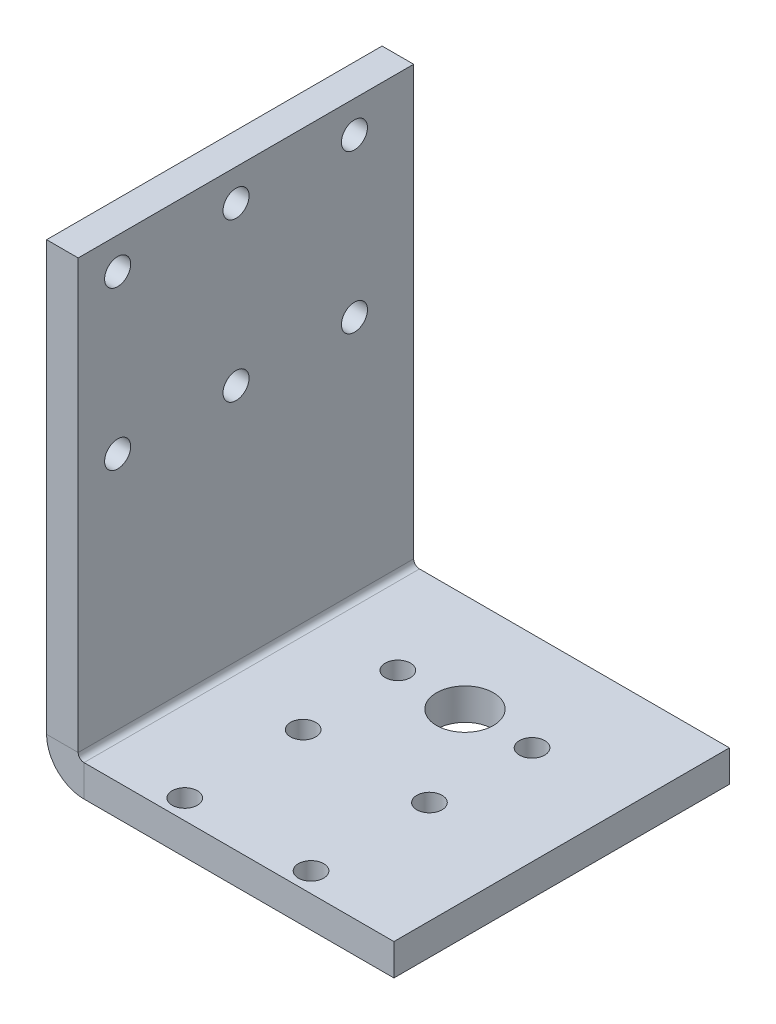
ISO-10303-21;
HEADER;
FILE_DESCRIPTION(('STEP AP214'),'2;1');
FILE_NAME('part.step','',(''),(''),'','','');
FILE_SCHEMA(('AUTOMOTIVE_DESIGN { 1 0 10303 214 1 1 1 1 }'));
ENDSEC;
DATA;
#1=APPLICATION_CONTEXT('core data for automotive mechanical design processes');
#2=APPLICATION_PROTOCOL_DEFINITION('international standard','automotive_design',2000,#1);
#3=PRODUCT_CONTEXT('',#1,'mechanical');
#4=PRODUCT('Part','Part','',(#3));
#5=PRODUCT_RELATED_PRODUCT_CATEGORY('part','',(#4));
#6=PRODUCT_DEFINITION_FORMATION('','',#4);
#7=PRODUCT_DEFINITION_CONTEXT('part definition',#1,'design');
#8=PRODUCT_DEFINITION('design','',#6,#7);
#9=PRODUCT_DEFINITION_SHAPE('','',#8);
#10=(LENGTH_UNIT() NAMED_UNIT(*) SI_UNIT(.MILLI.,.METRE.));
#11=(NAMED_UNIT(*) PLANE_ANGLE_UNIT() SI_UNIT($,.RADIAN.));
#12=(NAMED_UNIT(*) SI_UNIT($,.STERADIAN.) SOLID_ANGLE_UNIT());
#13=UNCERTAINTY_MEASURE_WITH_UNIT(LENGTH_MEASURE(1.E-05),#10,'distance_accuracy_value','');
#14=(GEOMETRIC_REPRESENTATION_CONTEXT(3) GLOBAL_UNCERTAINTY_ASSIGNED_CONTEXT((#13)) GLOBAL_UNIT_ASSIGNED_CONTEXT((#10,
#11,#12)) REPRESENTATION_CONTEXT('',''));
#15=CARTESIAN_POINT('',(0.,0.,0.));
#16=DIRECTION('',(0.,0.,1.));
#17=DIRECTION('',(1.,0.,0.));
#18=AXIS2_PLACEMENT_3D('',#15,#16,#17);
#19=CARTESIAN_POINT('',(0.,31.,-13.75));
#20=DIRECTION('',(1.,0.,0.));
#21=DIRECTION('',(0.,0.,-1.));
#22=AXIS2_PLACEMENT_3D('',#19,#20,#21);
#23=CYLINDRICAL_SURFACE('',#22,1.65);
#24=CARTESIAN_POINT('',(-4.,31.,-13.75));
#25=DIRECTION('',(1.,0.,0.));
#26=DIRECTION('',(0.,0.,-1.));
#27=AXIS2_PLACEMENT_3D('',#24,#25,#26);
#28=CIRCLE('',#27,1.65);
#29=CARTESIAN_POINT('',(-4.,31.,-15.4));
#30=VERTEX_POINT('',#29);
#31=EDGE_CURVE('E47',#30,#30,#28,.T.);
#32=ORIENTED_EDGE('',*,*,#31,.F.);
#33=EDGE_LOOP('',(#32));
#34=FACE_BOUND('',#33,.T.);
#35=CARTESIAN_POINT('',(0.,31.,-13.75));
#36=DIRECTION('',(1.,0.,0.));
#37=DIRECTION('',(0.,0.,-1.));
#38=AXIS2_PLACEMENT_3D('',#35,#36,#37);
#39=CIRCLE('',#38,1.65);
#40=CARTESIAN_POINT('',(0.,31.,-15.4));
#41=VERTEX_POINT('',#40);
#42=EDGE_CURVE('E11',#41,#41,#39,.T.);
#43=ORIENTED_EDGE('',*,*,#42,.T.);
#44=EDGE_LOOP('',(#43));
#45=FACE_BOUND('',#44,.T.);
#46=ADVANCED_FACE('F39',(#34,#45),#23,.F.);
#47=CARTESIAN_POINT('',(0.,51.,-13.75));
#48=DIRECTION('',(1.,0.,0.));
#49=DIRECTION('',(0.,0.,-1.));
#50=AXIS2_PLACEMENT_3D('',#47,#48,#49);
#51=CYLINDRICAL_SURFACE('',#50,1.65);
#52=CARTESIAN_POINT('',(-4.,51.,-13.75));
#53=DIRECTION('',(1.,0.,0.));
#54=DIRECTION('',(0.,0.,-1.));
#55=AXIS2_PLACEMENT_3D('',#52,#53,#54);
#56=CIRCLE('',#55,1.65);
#57=CARTESIAN_POINT('',(-4.,51.,-15.4));
#58=VERTEX_POINT('',#57);
#59=EDGE_CURVE('E183',#58,#58,#56,.T.);
#60=ORIENTED_EDGE('',*,*,#59,.F.);
#61=EDGE_LOOP('',(#60));
#62=FACE_BOUND('',#61,.T.);
#63=CARTESIAN_POINT('',(0.,51.,-13.75));
#64=DIRECTION('',(1.,0.,0.));
#65=DIRECTION('',(0.,0.,-1.));
#66=AXIS2_PLACEMENT_3D('',#63,#64,#65);
#67=CIRCLE('',#66,1.65);
#68=CARTESIAN_POINT('',(0.,51.,-15.4));
#69=VERTEX_POINT('',#68);
#70=EDGE_CURVE('E196',#69,#69,#67,.T.);
#71=ORIENTED_EDGE('',*,*,#70,.T.);
#72=EDGE_LOOP('',(#71));
#73=FACE_BOUND('',#72,.T.);
#74=ADVANCED_FACE('F204',(#62,#73),#51,.F.);
#75=CARTESIAN_POINT('',(0.7366,0.,21.25));
#76=DIRECTION('',(0.,0.,1.));
#77=DIRECTION('',(1.,0.,0.));
#78=AXIS2_PLACEMENT_3D('',#75,#76,#77);
#79=PLANE('',#78);
#80=DIRECTION('',(0.,-1.,0.));
#81=VECTOR('',#80,1.);
#82=CARTESIAN_POINT('',(0.7366,0.,21.25));
#83=LINE('',#82,#81);
#84=CARTESIAN_POINT('',(0.7366,0.,21.25));
#85=VERTEX_POINT('',#84);
#86=CARTESIAN_POINT('',(0.7366,-4.,21.25));
#87=VERTEX_POINT('',#86);
#88=EDGE_CURVE('E55',#85,#87,#83,.T.);
#89=ORIENTED_EDGE('',*,*,#88,.F.);
#90=CARTESIAN_POINT('',(0.7366,0.7366,21.25));
#91=DIRECTION('',(0.,0.,-1.));
#92=DIRECTION('',(-1.,0.,0.));
#93=AXIS2_PLACEMENT_3D('',#90,#91,#92);
#94=CIRCLE('',#93,0.7366);
#95=CARTESIAN_POINT('',(0.,0.7366,21.25));
#96=VERTEX_POINT('',#95);
#97=EDGE_CURVE('E139',#96,#85,#94,.F.);
#98=ORIENTED_EDGE('',*,*,#97,.F.);
#99=DIRECTION('',(1.,0.,0.));
#100=VECTOR('',#99,1.);
#101=CARTESIAN_POINT('',(-4.,0.736600000000001,21.25));
#102=LINE('',#101,#100);
#103=CARTESIAN_POINT('',(-4.,0.736600000000001,21.25));
#104=VERTEX_POINT('',#103);
#105=EDGE_CURVE('E180',#104,#96,#102,.T.);
#106=ORIENTED_EDGE('',*,*,#105,.F.);
#107=CARTESIAN_POINT('',(0.7366,0.7366,21.25));
#108=DIRECTION('',(0.,0.,1.));
#109=DIRECTION('',(1.,0.,0.));
#110=AXIS2_PLACEMENT_3D('',#107,#108,#109);
#111=CIRCLE('',#110,4.7366);
#112=EDGE_CURVE('E132',#104,#87,#111,.T.);
#113=ORIENTED_EDGE('',*,*,#112,.T.);
#114=EDGE_LOOP('',(#89,#98,#106,#113));
#115=FACE_BOUND('',#114,.T.);
#116=ADVANCED_FACE('F244',(#115),#79,.T.);
#117=CARTESIAN_POINT('',(-4.,0.736600000000001,21.25));
#118=DIRECTION('',(0.,0.,1.));
#119=DIRECTION('',(1.,0.,0.));
#120=AXIS2_PLACEMENT_3D('',#117,#118,#119);
#121=PLANE('',#120);
#122=DIRECTION('',(1.,0.,0.));
#123=VECTOR('',#122,1.);
#124=CARTESIAN_POINT('',(0.,0.,21.25));
#125=LINE('',#124,#123);
#126=CARTESIAN_POINT('',(40.,0.,21.25));
#127=VERTEX_POINT('',#126);
#128=EDGE_CURVE('E378',#85,#127,#125,.T.);
#129=ORIENTED_EDGE('',*,*,#128,.F.);
#130=ORIENTED_EDGE('',*,*,#88,.T.);
#131=DIRECTION('',(1.,0.,0.));
#132=VECTOR('',#131,1.);
#133=CARTESIAN_POINT('',(0.,-4.,21.25));
#134=LINE('',#133,#132);
#135=CARTESIAN_POINT('',(40.,-4.,21.25));
#136=VERTEX_POINT('',#135);
#137=EDGE_CURVE('E97',#87,#136,#134,.T.);
#138=ORIENTED_EDGE('',*,*,#137,.T.);
#139=DIRECTION('',(0.,-1.,0.));
#140=VECTOR('',#139,1.);
#141=CARTESIAN_POINT('',(40.,0.,21.25));
#142=LINE('',#141,#140);
#143=EDGE_CURVE('E375',#127,#136,#142,.T.);
#144=ORIENTED_EDGE('',*,*,#143,.F.);
#145=EDGE_LOOP('',(#129,#130,#138,#144));
#146=FACE_BOUND('',#145,.T.);
#147=ADVANCED_FACE('F241',(#146),#121,.T.);
#148=CARTESIAN_POINT('',(0.,0.7366,-21.25));
#149=DIRECTION('',(0.,0.,-1.));
#150=DIRECTION('',(-1.,0.,0.));
#151=AXIS2_PLACEMENT_3D('',#148,#149,#150);
#152=PLANE('',#151);
#153=DIRECTION('',(-1.,0.,0.));
#154=VECTOR('',#153,1.);
#155=CARTESIAN_POINT('',(0.,0.7366,-21.25));
#156=LINE('',#155,#154);
#157=CARTESIAN_POINT('',(0.,0.7366,-21.25));
#158=VERTEX_POINT('',#157);
#159=CARTESIAN_POINT('',(-4.,0.736600000000001,-21.25));
#160=VERTEX_POINT('',#159);
#161=EDGE_CURVE('E84',#158,#160,#156,.T.);
#162=ORIENTED_EDGE('',*,*,#161,.F.);
#163=CARTESIAN_POINT('',(0.7366,0.7366,-21.25));
#164=DIRECTION('',(0.,0.,-1.));
#165=DIRECTION('',(-1.,0.,0.));
#166=AXIS2_PLACEMENT_3D('',#163,#164,#165);
#167=CIRCLE('',#166,0.7366);
#168=CARTESIAN_POINT('',(0.7366,0.,-21.25));
#169=VERTEX_POINT('',#168);
#170=EDGE_CURVE('E155',#158,#169,#167,.F.);
#171=ORIENTED_EDGE('',*,*,#170,.T.);
#172=DIRECTION('',(0.,1.,0.));
#173=VECTOR('',#172,1.);
#174=CARTESIAN_POINT('',(0.7366,-4.,-21.25));
#175=LINE('',#174,#173);
#176=CARTESIAN_POINT('',(0.7366,-4.,-21.25));
#177=VERTEX_POINT('',#176);
#178=EDGE_CURVE('E91',#177,#169,#175,.T.);
#179=ORIENTED_EDGE('',*,*,#178,.F.);
#180=CARTESIAN_POINT('',(0.7366,0.7366,-21.25));
#181=DIRECTION('',(0.,0.,1.));
#182=DIRECTION('',(1.,0.,0.));
#183=AXIS2_PLACEMENT_3D('',#180,#181,#182);
#184=CIRCLE('',#183,4.7366);
#185=EDGE_CURVE('E162',#160,#177,#184,.T.);
#186=ORIENTED_EDGE('',*,*,#185,.F.);
#187=EDGE_LOOP('',(#162,#171,#179,#186));
#188=FACE_BOUND('',#187,.T.);
#189=ADVANCED_FACE('F238',(#188),#152,.T.);
#190=CARTESIAN_POINT('',(0.7366,-4.,-21.25));
#191=DIRECTION('',(0.,0.,-1.));
#192=DIRECTION('',(-1.,0.,0.));
#193=AXIS2_PLACEMENT_3D('',#190,#191,#192);
#194=PLANE('',#193);
#195=DIRECTION('',(0.,-1.,0.));
#196=VECTOR('',#195,1.);
#197=CARTESIAN_POINT('',(0.,0.,-21.25));
#198=LINE('',#197,#196);
#199=CARTESIAN_POINT('',(0.,55.,-21.25));
#200=VERTEX_POINT('',#199);
#201=EDGE_CURVE('E157',#200,#158,#198,.T.);
#202=ORIENTED_EDGE('',*,*,#201,.T.);
#203=ORIENTED_EDGE('',*,*,#161,.T.);
#204=DIRECTION('',(0.,1.,0.));
#205=VECTOR('',#204,1.);
#206=CARTESIAN_POINT('',(-4.,0.,-21.25));
#207=LINE('',#206,#205);
#208=CARTESIAN_POINT('',(-4.,55.,-21.25));
#209=VERTEX_POINT('',#208);
#210=EDGE_CURVE('E160',#209,#160,#207,.F.);
#211=ORIENTED_EDGE('',*,*,#210,.F.);
#212=DIRECTION('',(1.,0.,0.));
#213=VECTOR('',#212,1.);
#214=CARTESIAN_POINT('',(-4.,55.,-21.25));
#215=LINE('',#214,#213);
#216=EDGE_CURVE('E119',#209,#200,#215,.T.);
#217=ORIENTED_EDGE('',*,*,#216,.T.);
#218=EDGE_LOOP('',(#202,#203,#211,#217));
#219=FACE_BOUND('',#218,.T.);
#220=ADVANCED_FACE('F234',(#219),#194,.T.);
#221=CARTESIAN_POINT('',(0.,-4.,21.25));
#222=DIRECTION('',(0.,1.,0.));
#223=DIRECTION('',(0.,0.,1.));
#224=AXIS2_PLACEMENT_3D('',#221,#222,#223);
#225=PLANE('',#224);
#226=CARTESIAN_POINT('',(10.5,-4.,-8.75000000000001));
#227=DIRECTION('',(0.,-1.,0.));
#228=DIRECTION('',(0.,0.,-1.));
#229=AXIS2_PLACEMENT_3D('',#226,#227,#228);
#230=CIRCLE('',#229,1.59999999999999);
#231=CARTESIAN_POINT('',(10.5,-4.,-10.35));
#232=VERTEX_POINT('',#231);
#233=EDGE_CURVE('E193',#232,#232,#230,.T.);
#234=ORIENTED_EDGE('',*,*,#233,.F.);
#235=EDGE_LOOP('',(#234));
#236=FACE_BOUND('',#235,.T.);
#237=CARTESIAN_POINT('',(27.5,-4.,-8.75000000000001));
#238=DIRECTION('',(0.,-1.,0.));
#239=DIRECTION('',(0.,0.,-1.));
#240=AXIS2_PLACEMENT_3D('',#237,#238,#239);
#241=CIRCLE('',#240,1.59999999999999);
#242=CARTESIAN_POINT('',(27.5,-4.,-10.35));
#243=VERTEX_POINT('',#242);
#244=EDGE_CURVE('E192',#243,#243,#241,.T.);
#245=ORIENTED_EDGE('',*,*,#244,.F.);
#246=EDGE_LOOP('',(#245));
#247=FACE_BOUND('',#246,.T.);
#248=CARTESIAN_POINT('',(19.,-4.,-8.75000000000001));
#249=DIRECTION('',(0.,-1.,0.));
#250=DIRECTION('',(0.,0.,-1.));
#251=AXIS2_PLACEMENT_3D('',#248,#249,#250);
#252=CIRCLE('',#251,3.6);
#253=CARTESIAN_POINT('',(19.,-4.,-12.35));
#254=VERTEX_POINT('',#253);
#255=EDGE_CURVE('E188',#254,#254,#252,.T.);
#256=ORIENTED_EDGE('',*,*,#255,.F.);
#257=EDGE_LOOP('',(#256));
#258=FACE_BOUND('',#257,.T.);
#259=CARTESIAN_POINT('',(27.,-4.,18.75));
#260=DIRECTION('',(0.,1.,0.));
#261=DIRECTION('',(0.,0.,1.));
#262=AXIS2_PLACEMENT_3D('',#259,#260,#261);
#263=CIRCLE('',#262,1.59999999999999);
#264=CARTESIAN_POINT('',(27.,-4.,20.35));
#265=VERTEX_POINT('',#264);
#266=EDGE_CURVE('E354',#265,#265,#263,.T.);
#267=ORIENTED_EDGE('',*,*,#266,.T.);
#268=EDGE_LOOP('',(#267));
#269=FACE_BOUND('',#268,.T.);
#270=CARTESIAN_POINT('',(11.,-4.,3.74999999999999));
#271=DIRECTION('',(0.,1.,0.));
#272=DIRECTION('',(0.,0.,1.));
#273=AXIS2_PLACEMENT_3D('',#270,#271,#272);
#274=CIRCLE('',#273,1.59999999999999);
#275=CARTESIAN_POINT('',(11.,-4.,5.34999999999998));
#276=VERTEX_POINT('',#275);
#277=EDGE_CURVE('E360',#276,#276,#274,.T.);
#278=ORIENTED_EDGE('',*,*,#277,.T.);
#279=EDGE_LOOP('',(#278));
#280=FACE_BOUND('',#279,.T.);
#281=CARTESIAN_POINT('',(11.,-4.,18.75));
#282=DIRECTION('',(0.,1.,0.));
#283=DIRECTION('',(0.,0.,1.));
#284=AXIS2_PLACEMENT_3D('',#281,#282,#283);
#285=CIRCLE('',#284,1.59999999999999);
#286=CARTESIAN_POINT('',(11.,-4.,20.35));
#287=VERTEX_POINT('',#286);
#288=EDGE_CURVE('E366',#287,#287,#285,.T.);
#289=ORIENTED_EDGE('',*,*,#288,.T.);
#290=EDGE_LOOP('',(#289));
#291=FACE_BOUND('',#290,.T.);
#292=CARTESIAN_POINT('',(27.,-4.,3.74999999999999));
#293=DIRECTION('',(0.,1.,0.));
#294=DIRECTION('',(0.,0.,1.));
#295=AXIS2_PLACEMENT_3D('',#292,#293,#294);
#296=CIRCLE('',#295,1.59999999999999);
#297=CARTESIAN_POINT('',(27.,-4.,5.34999999999998));
#298=VERTEX_POINT('',#297);
#299=EDGE_CURVE('E149',#298,#298,#296,.T.);
#300=ORIENTED_EDGE('',*,*,#299,.T.);
#301=EDGE_LOOP('',(#300));
#302=FACE_BOUND('',#301,.T.);
#303=DIRECTION('',(1.,0.,0.));
#304=VECTOR('',#303,1.);
#305=CARTESIAN_POINT('',(0.,-4.,-21.25));
#306=LINE('',#305,#304);
#307=CARTESIAN_POINT('',(40.,-4.,-21.25));
#308=VERTEX_POINT('',#307);
#309=EDGE_CURVE('E145',#177,#308,#306,.T.);
#310=ORIENTED_EDGE('',*,*,#309,.T.);
#311=DIRECTION('',(0.,0.,-1.));
#312=VECTOR('',#311,1.);
#313=CARTESIAN_POINT('',(40.,-4.,21.25));
#314=LINE('',#313,#312);
#315=EDGE_CURVE('E176',#136,#308,#314,.T.);
#316=ORIENTED_EDGE('',*,*,#315,.F.);
#317=ORIENTED_EDGE('',*,*,#137,.F.);
#318=DIRECTION('',(0.,0.,-1.));
#319=VECTOR('',#318,1.);
#320=CARTESIAN_POINT('',(0.7366,-4.,21.25));
#321=LINE('',#320,#319);
#322=EDGE_CURVE('E144',#87,#177,#321,.T.);
#323=ORIENTED_EDGE('',*,*,#322,.T.);
#324=EDGE_LOOP('',(#310,#316,#317,#323));
#325=FACE_BOUND('',#324,.T.);
#326=ADVANCED_FACE('F230',(#236,#247,#258,#269,#280,#291,#302,#325),#225,.F.);
#327=CARTESIAN_POINT('',(40.,0.,21.25));
#328=DIRECTION('',(1.,0.,0.));
#329=DIRECTION('',(0.,0.,-1.));
#330=AXIS2_PLACEMENT_3D('',#327,#328,#329);
#331=PLANE('',#330);
#332=DIRECTION('',(0.,-1.,0.));
#333=VECTOR('',#332,1.);
#334=CARTESIAN_POINT('',(40.,0.,-21.25));
#335=LINE('',#334,#333);
#336=CARTESIAN_POINT('',(40.,0.,-21.25));
#337=VERTEX_POINT('',#336);
#338=EDGE_CURVE('E148',#337,#308,#335,.T.);
#339=ORIENTED_EDGE('',*,*,#338,.F.);
#340=DIRECTION('',(0.,0.,-1.));
#341=VECTOR('',#340,1.);
#342=CARTESIAN_POINT('',(40.,0.,21.25));
#343=LINE('',#342,#341);
#344=EDGE_CURVE('E174',#127,#337,#343,.T.);
#345=ORIENTED_EDGE('',*,*,#344,.F.);
#346=ORIENTED_EDGE('',*,*,#143,.T.);
#347=ORIENTED_EDGE('',*,*,#315,.T.);
#348=EDGE_LOOP('',(#339,#345,#346,#347));
#349=FACE_BOUND('',#348,.T.);
#350=ADVANCED_FACE('F226',(#349),#331,.T.);
#351=CARTESIAN_POINT('',(0.,0.,21.25));
#352=DIRECTION('',(0.,1.,0.));
#353=DIRECTION('',(0.,0.,1.));
#354=AXIS2_PLACEMENT_3D('',#351,#352,#353);
#355=PLANE('',#354);
#356=CARTESIAN_POINT('',(10.5,0.,-8.75000000000001));
#357=DIRECTION('',(0.,1.,0.));
#358=DIRECTION('',(0.,0.,1.));
#359=AXIS2_PLACEMENT_3D('',#356,#357,#358);
#360=CIRCLE('',#359,1.59999999999999);
#361=CARTESIAN_POINT('',(10.5,0.,-7.15000000000002));
#362=VERTEX_POINT('',#361);
#363=EDGE_CURVE('E189',#362,#362,#360,.T.);
#364=ORIENTED_EDGE('',*,*,#363,.F.);
#365=EDGE_LOOP('',(#364));
#366=FACE_BOUND('',#365,.T.);
#367=CARTESIAN_POINT('',(27.5,0.,-8.75000000000001));
#368=DIRECTION('',(0.,1.,0.));
#369=DIRECTION('',(0.,0.,1.));
#370=AXIS2_PLACEMENT_3D('',#367,#368,#369);
#371=CIRCLE('',#370,1.59999999999999);
#372=CARTESIAN_POINT('',(27.5,0.,-7.15000000000002));
#373=VERTEX_POINT('',#372);
#374=EDGE_CURVE('E335',#373,#373,#371,.T.);
#375=ORIENTED_EDGE('',*,*,#374,.F.);
#376=EDGE_LOOP('',(#375));
#377=FACE_BOUND('',#376,.T.);
#378=CARTESIAN_POINT('',(19.,0.,-8.75000000000001));
#379=DIRECTION('',(0.,1.,0.));
#380=DIRECTION('',(0.,0.,1.));
#381=AXIS2_PLACEMENT_3D('',#378,#379,#380);
#382=CIRCLE('',#381,3.6);
#383=CARTESIAN_POINT('',(19.,0.,-5.15000000000001));
#384=VERTEX_POINT('',#383);
#385=EDGE_CURVE('E184',#384,#384,#382,.T.);
#386=ORIENTED_EDGE('',*,*,#385,.F.);
#387=EDGE_LOOP('',(#386));
#388=FACE_BOUND('',#387,.T.);
#389=CARTESIAN_POINT('',(27.,0.,18.75));
#390=DIRECTION('',(0.,1.,0.));
#391=DIRECTION('',(0.,0.,1.));
#392=AXIS2_PLACEMENT_3D('',#389,#390,#391);
#393=CIRCLE('',#392,1.59999999999999);
#394=CARTESIAN_POINT('',(27.,0.,20.35));
#395=VERTEX_POINT('',#394);
#396=EDGE_CURVE('E187',#395,#395,#393,.T.);
#397=ORIENTED_EDGE('',*,*,#396,.F.);
#398=EDGE_LOOP('',(#397));
#399=FACE_BOUND('',#398,.T.);
#400=CARTESIAN_POINT('',(11.,0.,3.74999999999999));
#401=DIRECTION('',(0.,1.,0.));
#402=DIRECTION('',(0.,0.,1.));
#403=AXIS2_PLACEMENT_3D('',#400,#401,#402);
#404=CIRCLE('',#403,1.59999999999999);
#405=CARTESIAN_POINT('',(11.,0.,5.34999999999998));
#406=VERTEX_POINT('',#405);
#407=EDGE_CURVE('E357',#406,#406,#404,.T.);
#408=ORIENTED_EDGE('',*,*,#407,.F.);
#409=EDGE_LOOP('',(#408));
#410=FACE_BOUND('',#409,.T.);
#411=CARTESIAN_POINT('',(11.,0.,18.75));
#412=DIRECTION('',(0.,1.,0.));
#413=DIRECTION('',(0.,0.,1.));
#414=AXIS2_PLACEMENT_3D('',#411,#412,#413);
#415=CIRCLE('',#414,1.59999999999999);
#416=CARTESIAN_POINT('',(11.,0.,20.35));
#417=VERTEX_POINT('',#416);
#418=EDGE_CURVE('E363',#417,#417,#415,.T.);
#419=ORIENTED_EDGE('',*,*,#418,.F.);
#420=EDGE_LOOP('',(#419));
#421=FACE_BOUND('',#420,.T.);
#422=CARTESIAN_POINT('',(27.,0.,3.74999999999999));
#423=DIRECTION('',(0.,1.,0.));
#424=DIRECTION('',(0.,0.,1.));
#425=AXIS2_PLACEMENT_3D('',#422,#423,#424);
#426=CIRCLE('',#425,1.59999999999999);
#427=CARTESIAN_POINT('',(27.,0.,5.34999999999998));
#428=VERTEX_POINT('',#427);
#429=EDGE_CURVE('E369',#428,#428,#426,.T.);
#430=ORIENTED_EDGE('',*,*,#429,.F.);
#431=EDGE_LOOP('',(#430));
#432=FACE_BOUND('',#431,.T.);
#433=DIRECTION('',(1.,0.,0.));
#434=VECTOR('',#433,1.);
#435=CARTESIAN_POINT('',(0.,0.,-21.25));
#436=LINE('',#435,#434);
#437=EDGE_CURVE('E152',#169,#337,#436,.T.);
#438=ORIENTED_EDGE('',*,*,#437,.F.);
#439=DIRECTION('',(0.,0.,-1.));
#440=VECTOR('',#439,1.);
#441=CARTESIAN_POINT('',(0.7366,0.,21.25));
#442=LINE('',#441,#440);
#443=EDGE_CURVE('E171',#85,#169,#442,.T.);
#444=ORIENTED_EDGE('',*,*,#443,.F.);
#445=ORIENTED_EDGE('',*,*,#128,.T.);
#446=ORIENTED_EDGE('',*,*,#344,.T.);
#447=EDGE_LOOP('',(#438,#444,#445,#446));
#448=FACE_BOUND('',#447,.T.);
#449=ADVANCED_FACE('F217',(#366,#377,#388,#399,#410,#421,#432,#448),#355,.T.);
#450=CARTESIAN_POINT('',(0.7366,0.7366,21.25));
#451=DIRECTION('',(0.,0.,-1.));
#452=DIRECTION('',(-1.,0.,0.));
#453=AXIS2_PLACEMENT_3D('',#450,#451,#452);
#454=CYLINDRICAL_SURFACE('',#453,0.7366);
#455=ORIENTED_EDGE('',*,*,#170,.F.);
#456=DIRECTION('',(0.,0.,-1.));
#457=VECTOR('',#456,1.);
#458=CARTESIAN_POINT('',(0.,0.7366,21.25));
#459=LINE('',#458,#457);
#460=EDGE_CURVE('E168',#96,#158,#459,.T.);
#461=ORIENTED_EDGE('',*,*,#460,.F.);
#462=ORIENTED_EDGE('',*,*,#97,.T.);
#463=ORIENTED_EDGE('',*,*,#443,.T.);
#464=EDGE_LOOP('',(#455,#461,#462,#463));
#465=FACE_BOUND('',#464,.T.);
#466=ADVANCED_FACE('F209',(#465),#454,.F.);
#467=CARTESIAN_POINT('',(0.,0.,21.25));
#468=DIRECTION('',(1.,0.,0.));
#469=DIRECTION('',(0.,0.,-1.));
#470=AXIS2_PLACEMENT_3D('',#467,#468,#469);
#471=PLANE('',#470);
#472=CARTESIAN_POINT('',(0.,31.,1.25));
#473=DIRECTION('',(1.,0.,0.));
#474=DIRECTION('',(0.,0.,-1.));
#475=AXIS2_PLACEMENT_3D('',#472,#473,#474);
#476=CIRCLE('',#475,1.65);
#477=CARTESIAN_POINT('',(0.,31.,-0.399999999999998));
#478=VERTEX_POINT('',#477);
#479=EDGE_CURVE('E321',#478,#478,#476,.T.);
#480=ORIENTED_EDGE('',*,*,#479,.F.);
#481=EDGE_LOOP('',(#480));
#482=FACE_BOUND('',#481,.T.);
#483=CARTESIAN_POINT('',(0.,51.,1.25));
#484=DIRECTION('',(1.,0.,0.));
#485=DIRECTION('',(0.,0.,-1.));
#486=AXIS2_PLACEMENT_3D('',#483,#484,#485);
#487=CIRCLE('',#486,1.65);
#488=CARTESIAN_POINT('',(0.,51.,-0.400000000000001));
#489=VERTEX_POINT('',#488);
#490=EDGE_CURVE('E325',#489,#489,#487,.T.);
#491=ORIENTED_EDGE('',*,*,#490,.F.);
#492=EDGE_LOOP('',(#491));
#493=FACE_BOUND('',#492,.T.);
#494=CARTESIAN_POINT('',(0.,51.,16.25));
#495=DIRECTION('',(1.,0.,0.));
#496=DIRECTION('',(0.,0.,-1.));
#497=AXIS2_PLACEMENT_3D('',#494,#495,#496);
#498=CIRCLE('',#497,1.65);
#499=CARTESIAN_POINT('',(0.,51.,14.6));
#500=VERTEX_POINT('',#499);
#501=EDGE_CURVE('E338',#500,#500,#498,.T.);
#502=ORIENTED_EDGE('',*,*,#501,.F.);
#503=EDGE_LOOP('',(#502));
#504=FACE_BOUND('',#503,.T.);
#505=CARTESIAN_POINT('',(0.,31.,16.25));
#506=DIRECTION('',(1.,0.,0.));
#507=DIRECTION('',(0.,0.,-1.));
#508=AXIS2_PLACEMENT_3D('',#505,#506,#507);
#509=CIRCLE('',#508,1.65);
#510=CARTESIAN_POINT('',(0.,31.,14.6));
#511=VERTEX_POINT('',#510);
#512=EDGE_CURVE('E344',#511,#511,#509,.T.);
#513=ORIENTED_EDGE('',*,*,#512,.F.);
#514=EDGE_LOOP('',(#513));
#515=FACE_BOUND('',#514,.T.);
#516=ORIENTED_EDGE('',*,*,#201,.F.);
#517=DIRECTION('',(0.,0.,-1.));
#518=VECTOR('',#517,1.);
#519=CARTESIAN_POINT('',(0.,55.,21.25));
#520=LINE('',#519,#518);
#521=CARTESIAN_POINT('',(0.,55.,21.25));
#522=VERTEX_POINT('',#521);
#523=EDGE_CURVE('E121',#522,#200,#520,.T.);
#524=ORIENTED_EDGE('',*,*,#523,.F.);
#525=DIRECTION('',(0.,-1.,0.));
#526=VECTOR('',#525,1.);
#527=CARTESIAN_POINT('',(0.,0.,21.25));
#528=LINE('',#527,#526);
#529=EDGE_CURVE('E137',#522,#96,#528,.T.);
#530=ORIENTED_EDGE('',*,*,#529,.T.);
#531=ORIENTED_EDGE('',*,*,#460,.T.);
#532=EDGE_LOOP('',(#516,#524,#530,#531));
#533=FACE_BOUND('',#532,.T.);
#534=ORIENTED_EDGE('',*,*,#70,.F.);
#535=EDGE_LOOP('',(#534));
#536=FACE_BOUND('',#535,.T.);
#537=ORIENTED_EDGE('',*,*,#42,.F.);
#538=EDGE_LOOP('',(#537));
#539=FACE_BOUND('',#538,.T.);
#540=ADVANCED_FACE('F207',(#482,#493,#504,#515,#533,#536,#539),#471,.T.);
#541=CARTESIAN_POINT('',(-4.,55.,21.25));
#542=DIRECTION('',(0.,1.,0.));
#543=DIRECTION('',(0.,0.,1.));
#544=AXIS2_PLACEMENT_3D('',#541,#542,#543);
#545=PLANE('',#544);
#546=ORIENTED_EDGE('',*,*,#216,.F.);
#547=DIRECTION('',(0.,0.,-1.));
#548=VECTOR('',#547,1.);
#549=CARTESIAN_POINT('',(-4.,55.,21.25));
#550=LINE('',#549,#548);
#551=CARTESIAN_POINT('',(-4.,55.,21.25));
#552=VERTEX_POINT('',#551);
#553=EDGE_CURVE('E113',#552,#209,#550,.T.);
#554=ORIENTED_EDGE('',*,*,#553,.F.);
#555=DIRECTION('',(1.,0.,0.));
#556=VECTOR('',#555,1.);
#557=CARTESIAN_POINT('',(-4.,55.,21.25));
#558=LINE('',#557,#556);
#559=EDGE_CURVE('E117',#552,#522,#558,.T.);
#560=ORIENTED_EDGE('',*,*,#559,.T.);
#561=ORIENTED_EDGE('',*,*,#523,.T.);
#562=EDGE_LOOP('',(#546,#554,#560,#561));
#563=FACE_BOUND('',#562,.T.);
#564=ADVANCED_FACE('F115',(#563),#545,.T.);
#565=CARTESIAN_POINT('',(-4.,0.,21.25));
#566=DIRECTION('',(1.,0.,0.));
#567=DIRECTION('',(0.,0.,-1.));
#568=AXIS2_PLACEMENT_3D('',#565,#566,#567);
#569=PLANE('',#568);
#570=CARTESIAN_POINT('',(-4.,31.,1.25));
#571=DIRECTION('',(1.,0.,0.));
#572=DIRECTION('',(0.,0.,-1.));
#573=AXIS2_PLACEMENT_3D('',#570,#571,#572);
#574=CIRCLE('',#573,1.65);
#575=CARTESIAN_POINT('',(-4.,31.,-0.399999999999998));
#576=VERTEX_POINT('',#575);
#577=EDGE_CURVE('E319',#576,#576,#574,.T.);
#578=ORIENTED_EDGE('',*,*,#577,.T.);
#579=EDGE_LOOP('',(#578));
#580=FACE_BOUND('',#579,.T.);
#581=CARTESIAN_POINT('',(-4.,51.,1.25));
#582=DIRECTION('',(1.,0.,0.));
#583=DIRECTION('',(0.,0.,-1.));
#584=AXIS2_PLACEMENT_3D('',#581,#582,#583);
#585=CIRCLE('',#584,1.65);
#586=CARTESIAN_POINT('',(-4.,51.,-0.400000000000001));
#587=VERTEX_POINT('',#586);
#588=EDGE_CURVE('E322',#587,#587,#585,.T.);
#589=ORIENTED_EDGE('',*,*,#588,.T.);
#590=EDGE_LOOP('',(#589));
#591=FACE_BOUND('',#590,.T.);
#592=CARTESIAN_POINT('',(-4.,51.,16.25));
#593=DIRECTION('',(1.,0.,0.));
#594=DIRECTION('',(0.,0.,-1.));
#595=AXIS2_PLACEMENT_3D('',#592,#593,#594);
#596=CIRCLE('',#595,1.65);
#597=CARTESIAN_POINT('',(-4.,51.,14.6));
#598=VERTEX_POINT('',#597);
#599=EDGE_CURVE('E341',#598,#598,#596,.T.);
#600=ORIENTED_EDGE('',*,*,#599,.T.);
#601=EDGE_LOOP('',(#600));
#602=FACE_BOUND('',#601,.T.);
#603=CARTESIAN_POINT('',(-4.,31.,16.25));
#604=DIRECTION('',(1.,0.,0.));
#605=DIRECTION('',(0.,0.,-1.));
#606=AXIS2_PLACEMENT_3D('',#603,#604,#605);
#607=CIRCLE('',#606,1.65);
#608=CARTESIAN_POINT('',(-4.,31.,14.6));
#609=VERTEX_POINT('',#608);
#610=EDGE_CURVE('E347',#609,#609,#607,.T.);
#611=ORIENTED_EDGE('',*,*,#610,.T.);
#612=EDGE_LOOP('',(#611));
#613=FACE_BOUND('',#612,.T.);
#614=ORIENTED_EDGE('',*,*,#210,.T.);
#615=DIRECTION('',(0.,0.,-1.));
#616=VECTOR('',#615,1.);
#617=CARTESIAN_POINT('',(-4.,0.736600000000001,21.25));
#618=LINE('',#617,#616);
#619=EDGE_CURVE('E122',#104,#160,#618,.T.);
#620=ORIENTED_EDGE('',*,*,#619,.F.);
#621=DIRECTION('',(0.,1.,0.));
#622=VECTOR('',#621,1.);
#623=CARTESIAN_POINT('',(-4.,0.,21.25));
#624=LINE('',#623,#622);
#625=EDGE_CURVE('E126',#552,#104,#624,.F.);
#626=ORIENTED_EDGE('',*,*,#625,.F.);
#627=ORIENTED_EDGE('',*,*,#553,.T.);
#628=EDGE_LOOP('',(#614,#620,#626,#627));
#629=FACE_BOUND('',#628,.T.);
#630=ORIENTED_EDGE('',*,*,#59,.T.);
#631=EDGE_LOOP('',(#630));
#632=FACE_BOUND('',#631,.T.);
#633=ORIENTED_EDGE('',*,*,#31,.T.);
#634=EDGE_LOOP('',(#633));
#635=FACE_BOUND('',#634,.T.);
#636=ADVANCED_FACE('F127',(#580,#591,#602,#613,#629,#632,#635),#569,.F.);
#637=CARTESIAN_POINT('',(0.7366,0.7366,21.25));
#638=DIRECTION('',(0.,0.,-1.));
#639=DIRECTION('',(-1.,0.,0.));
#640=AXIS2_PLACEMENT_3D('',#637,#638,#639);
#641=CYLINDRICAL_SURFACE('',#640,4.7366);
#642=ORIENTED_EDGE('',*,*,#185,.T.);
#643=ORIENTED_EDGE('',*,*,#322,.F.);
#644=ORIENTED_EDGE('',*,*,#112,.F.);
#645=ORIENTED_EDGE('',*,*,#619,.T.);
#646=EDGE_LOOP('',(#642,#643,#644,#645));
#647=FACE_BOUND('',#646,.T.);
#648=ADVANCED_FACE('F256',(#647),#641,.T.);
#649=CARTESIAN_POINT('',(0.7366,0.7366,21.25));
#650=DIRECTION('',(0.,0.,-1.));
#651=DIRECTION('',(-1.,0.,0.));
#652=AXIS2_PLACEMENT_3D('',#649,#650,#651);
#653=PLANE('',#652);
#654=ORIENTED_EDGE('',*,*,#625,.T.);
#655=ORIENTED_EDGE('',*,*,#105,.T.);
#656=ORIENTED_EDGE('',*,*,#529,.F.);
#657=ORIENTED_EDGE('',*,*,#559,.F.);
#658=EDGE_LOOP('',(#654,#655,#656,#657));
#659=FACE_BOUND('',#658,.T.);
#660=ADVANCED_FACE('F135',(#659),#653,.F.);
#661=CARTESIAN_POINT('',(0.7366,0.7366,-21.25));
#662=DIRECTION('',(0.,0.,-1.));
#663=DIRECTION('',(-1.,0.,0.));
#664=AXIS2_PLACEMENT_3D('',#661,#662,#663);
#665=PLANE('',#664);
#666=ORIENTED_EDGE('',*,*,#309,.F.);
#667=ORIENTED_EDGE('',*,*,#178,.T.);
#668=ORIENTED_EDGE('',*,*,#437,.T.);
#669=ORIENTED_EDGE('',*,*,#338,.T.);
#670=EDGE_LOOP('',(#666,#667,#668,#669));
#671=FACE_BOUND('',#670,.T.);
#672=ADVANCED_FACE('F266',(#671),#665,.T.);
#673=CARTESIAN_POINT('',(27.,0.,3.74999999999999));
#674=DIRECTION('',(0.,1.,0.));
#675=DIRECTION('',(0.,0.,1.));
#676=AXIS2_PLACEMENT_3D('',#673,#674,#675);
#677=CYLINDRICAL_SURFACE('',#676,1.59999999999999);
#678=ORIENTED_EDGE('',*,*,#299,.F.);
#679=EDGE_LOOP('',(#678));
#680=FACE_BOUND('',#679,.T.);
#681=ORIENTED_EDGE('',*,*,#429,.T.);
#682=EDGE_LOOP('',(#681));
#683=FACE_BOUND('',#682,.T.);
#684=ADVANCED_FACE('F269',(#680,#683),#677,.F.);
#685=CARTESIAN_POINT('',(11.,0.,18.75));
#686=DIRECTION('',(0.,1.,0.));
#687=DIRECTION('',(0.,0.,1.));
#688=AXIS2_PLACEMENT_3D('',#685,#686,#687);
#689=CYLINDRICAL_SURFACE('',#688,1.59999999999999);
#690=ORIENTED_EDGE('',*,*,#288,.F.);
#691=EDGE_LOOP('',(#690));
#692=FACE_BOUND('',#691,.T.);
#693=ORIENTED_EDGE('',*,*,#418,.T.);
#694=EDGE_LOOP('',(#693));
#695=FACE_BOUND('',#694,.T.);
#696=ADVANCED_FACE('F275',(#692,#695),#689,.F.);
#697=CARTESIAN_POINT('',(11.,0.,3.74999999999999));
#698=DIRECTION('',(0.,1.,0.));
#699=DIRECTION('',(0.,0.,1.));
#700=AXIS2_PLACEMENT_3D('',#697,#698,#699);
#701=CYLINDRICAL_SURFACE('',#700,1.59999999999999);
#702=ORIENTED_EDGE('',*,*,#277,.F.);
#703=EDGE_LOOP('',(#702));
#704=FACE_BOUND('',#703,.T.);
#705=ORIENTED_EDGE('',*,*,#407,.T.);
#706=EDGE_LOOP('',(#705));
#707=FACE_BOUND('',#706,.T.);
#708=ADVANCED_FACE('F279',(#704,#707),#701,.F.);
#709=CARTESIAN_POINT('',(27.,0.,18.75));
#710=DIRECTION('',(0.,1.,0.));
#711=DIRECTION('',(0.,0.,1.));
#712=AXIS2_PLACEMENT_3D('',#709,#710,#711);
#713=CYLINDRICAL_SURFACE('',#712,1.59999999999999);
#714=ORIENTED_EDGE('',*,*,#266,.F.);
#715=EDGE_LOOP('',(#714));
#716=FACE_BOUND('',#715,.T.);
#717=ORIENTED_EDGE('',*,*,#396,.T.);
#718=EDGE_LOOP('',(#717));
#719=FACE_BOUND('',#718,.T.);
#720=ADVANCED_FACE('F283',(#716,#719),#713,.F.);
#721=CARTESIAN_POINT('',(19.,55.,-8.75000000000001));
#722=DIRECTION('',(0.,-1.,0.));
#723=DIRECTION('',(0.,0.,-1.));
#724=AXIS2_PLACEMENT_3D('',#721,#722,#723);
#725=CYLINDRICAL_SURFACE('',#724,3.6);
#726=ORIENTED_EDGE('',*,*,#385,.T.);
#727=EDGE_LOOP('',(#726));
#728=FACE_BOUND('',#727,.T.);
#729=ORIENTED_EDGE('',*,*,#255,.T.);
#730=EDGE_LOOP('',(#729));
#731=FACE_BOUND('',#730,.T.);
#732=ADVANCED_FACE('F287',(#728,#731),#725,.F.);
#733=CARTESIAN_POINT('',(0.,31.,16.25));
#734=DIRECTION('',(1.,0.,0.));
#735=DIRECTION('',(0.,0.,-1.));
#736=AXIS2_PLACEMENT_3D('',#733,#734,#735);
#737=CYLINDRICAL_SURFACE('',#736,1.65);
#738=ORIENTED_EDGE('',*,*,#610,.F.);
#739=EDGE_LOOP('',(#738));
#740=FACE_BOUND('',#739,.T.);
#741=ORIENTED_EDGE('',*,*,#512,.T.);
#742=EDGE_LOOP('',(#741));
#743=FACE_BOUND('',#742,.T.);
#744=ADVANCED_FACE('F291',(#740,#743),#737,.F.);
#745=CARTESIAN_POINT('',(0.,51.,16.25));
#746=DIRECTION('',(1.,0.,0.));
#747=DIRECTION('',(0.,0.,-1.));
#748=AXIS2_PLACEMENT_3D('',#745,#746,#747);
#749=CYLINDRICAL_SURFACE('',#748,1.65);
#750=ORIENTED_EDGE('',*,*,#599,.F.);
#751=EDGE_LOOP('',(#750));
#752=FACE_BOUND('',#751,.T.);
#753=ORIENTED_EDGE('',*,*,#501,.T.);
#754=EDGE_LOOP('',(#753));
#755=FACE_BOUND('',#754,.T.);
#756=ADVANCED_FACE('F295',(#752,#755),#749,.F.);
#757=CARTESIAN_POINT('',(27.5,-4.,-8.75000000000001));
#758=DIRECTION('',(0.,-1.,0.));
#759=DIRECTION('',(0.,0.,-1.));
#760=AXIS2_PLACEMENT_3D('',#757,#758,#759);
#761=CYLINDRICAL_SURFACE('',#760,1.59999999999999);
#762=ORIENTED_EDGE('',*,*,#374,.T.);
#763=EDGE_LOOP('',(#762));
#764=FACE_BOUND('',#763,.T.);
#765=ORIENTED_EDGE('',*,*,#244,.T.);
#766=EDGE_LOOP('',(#765));
#767=FACE_BOUND('',#766,.T.);
#768=ADVANCED_FACE('F299',(#764,#767),#761,.F.);
#769=CARTESIAN_POINT('',(10.5,-4.,-8.75000000000001));
#770=DIRECTION('',(0.,-1.,0.));
#771=DIRECTION('',(0.,0.,-1.));
#772=AXIS2_PLACEMENT_3D('',#769,#770,#771);
#773=CYLINDRICAL_SURFACE('',#772,1.59999999999999);
#774=ORIENTED_EDGE('',*,*,#363,.T.);
#775=EDGE_LOOP('',(#774));
#776=FACE_BOUND('',#775,.T.);
#777=ORIENTED_EDGE('',*,*,#233,.T.);
#778=EDGE_LOOP('',(#777));
#779=FACE_BOUND('',#778,.T.);
#780=ADVANCED_FACE('F303',(#776,#779),#773,.F.);
#781=CARTESIAN_POINT('',(0.,51.,1.25));
#782=DIRECTION('',(1.,0.,0.));
#783=DIRECTION('',(0.,0.,-1.));
#784=AXIS2_PLACEMENT_3D('',#781,#782,#783);
#785=CYLINDRICAL_SURFACE('',#784,1.65);
#786=ORIENTED_EDGE('',*,*,#588,.F.);
#787=EDGE_LOOP('',(#786));
#788=FACE_BOUND('',#787,.T.);
#789=ORIENTED_EDGE('',*,*,#490,.T.);
#790=EDGE_LOOP('',(#789));
#791=FACE_BOUND('',#790,.T.);
#792=ADVANCED_FACE('F307',(#788,#791),#785,.F.);
#793=CARTESIAN_POINT('',(0.,31.,1.25));
#794=DIRECTION('',(1.,0.,0.));
#795=DIRECTION('',(0.,0.,-1.));
#796=AXIS2_PLACEMENT_3D('',#793,#794,#795);
#797=CYLINDRICAL_SURFACE('',#796,1.65);
#798=ORIENTED_EDGE('',*,*,#577,.F.);
#799=EDGE_LOOP('',(#798));
#800=FACE_BOUND('',#799,.T.);
#801=ORIENTED_EDGE('',*,*,#479,.T.);
#802=EDGE_LOOP('',(#801));
#803=FACE_BOUND('',#802,.T.);
#804=ADVANCED_FACE('F311',(#800,#803),#797,.F.);
#805=CLOSED_SHELL('',(#46,#74,#116,#147,#189,#220,#326,#350,#449,#466,#540,#564,#636,#648,#660,
#672,#684,#696,#708,#720,#732,#744,#756,#768,#780,#792,#804));
#806=MANIFOLD_SOLID_BREP('B2',#805);
#807=ADVANCED_BREP_SHAPE_REPRESENTATION('',(#18,#806),#14);
#808=SHAPE_DEFINITION_REPRESENTATION(#9,#807);
ENDSEC;
END-ISO-10303-21;
